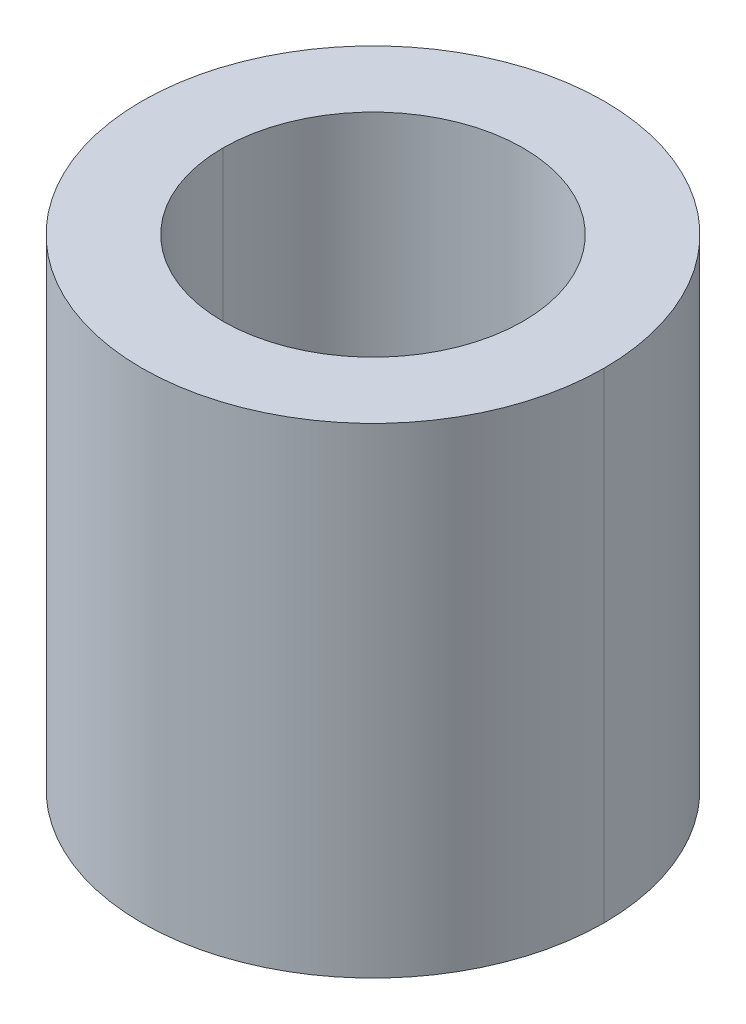
ISO-10303-21;
HEADER;
FILE_DESCRIPTION(('STEP AP214'),'2;1');
FILE_NAME('part.step','',(''),(''),'','','');
FILE_SCHEMA(('AUTOMOTIVE_DESIGN { 1 0 10303 214 1 1 1 1 }'));
ENDSEC;
DATA;
#1=APPLICATION_CONTEXT('core data for automotive mechanical design processes');
#2=APPLICATION_PROTOCOL_DEFINITION('international standard','automotive_design',2000,#1);
#3=PRODUCT_CONTEXT('',#1,'mechanical');
#4=PRODUCT('Part','Part','',(#3));
#5=PRODUCT_RELATED_PRODUCT_CATEGORY('part','',(#4));
#6=PRODUCT_DEFINITION_FORMATION('','',#4);
#7=PRODUCT_DEFINITION_CONTEXT('part definition',#1,'design');
#8=PRODUCT_DEFINITION('design','',#6,#7);
#9=PRODUCT_DEFINITION_SHAPE('','',#8);
#10=(LENGTH_UNIT() NAMED_UNIT(*) SI_UNIT(.MILLI.,.METRE.));
#11=(NAMED_UNIT(*) PLANE_ANGLE_UNIT() SI_UNIT($,.RADIAN.));
#12=(NAMED_UNIT(*) SI_UNIT($,.STERADIAN.) SOLID_ANGLE_UNIT());
#13=UNCERTAINTY_MEASURE_WITH_UNIT(LENGTH_MEASURE(1.E-05),#10,'distance_accuracy_value','');
#14=(GEOMETRIC_REPRESENTATION_CONTEXT(3) GLOBAL_UNCERTAINTY_ASSIGNED_CONTEXT((#13)) GLOBAL_UNIT_ASSIGNED_CONTEXT((#10,
#11,#12)) REPRESENTATION_CONTEXT('',''));
#15=CARTESIAN_POINT('',(0.,0.,0.));
#16=DIRECTION('',(0.,0.,1.));
#17=DIRECTION('',(1.,0.,0.));
#18=AXIS2_PLACEMENT_3D('',#15,#16,#17);
#19=CARTESIAN_POINT('',(0.,0.,0.));
#20=DIRECTION('',(0.,1.,0.));
#21=DIRECTION('',(1.,0.,0.));
#22=AXIS2_PLACEMENT_3D('',#19,#20,#21);
#23=PLANE('',#22);
#24=CARTESIAN_POINT('',(0.,0.,0.));
#25=DIRECTION('',(0.,1.,0.));
#26=DIRECTION('',(-1.,0.,0.));
#27=AXIS2_PLACEMENT_3D('',#24,#25,#26);
#28=CIRCLE('',#27,1.925);
#29=CARTESIAN_POINT('',(-1.925,0.,0.));
#30=VERTEX_POINT('',#29);
#31=CARTESIAN_POINT('',(1.925,0.,0.));
#32=VERTEX_POINT('',#31);
#33=EDGE_CURVE('E42',#30,#32,#28,.T.);
#34=ORIENTED_EDGE('',*,*,#33,.F.);
#35=CARTESIAN_POINT('',(0.,0.,0.));
#36=DIRECTION('',(0.,1.,0.));
#37=DIRECTION('',(1.,0.,0.));
#38=AXIS2_PLACEMENT_3D('',#35,#36,#37);
#39=CIRCLE('',#38,1.925);
#40=EDGE_CURVE('E111',#32,#30,#39,.T.);
#41=ORIENTED_EDGE('',*,*,#40,.F.);
#42=EDGE_LOOP('',(#34,#41));
#43=FACE_BOUND('',#42,.T.);
#44=CARTESIAN_POINT('',(0.,0.,0.));
#45=DIRECTION('',(0.,-1.,0.));
#46=DIRECTION('',(-1.,0.,0.));
#47=AXIS2_PLACEMENT_3D('',#44,#45,#46);
#48=CIRCLE('',#47,1.25);
#49=CARTESIAN_POINT('',(-1.25,0.,0.));
#50=VERTEX_POINT('',#49);
#51=CARTESIAN_POINT('',(1.25,0.,0.));
#52=VERTEX_POINT('',#51);
#53=EDGE_CURVE('E21',#50,#52,#48,.T.);
#54=ORIENTED_EDGE('',*,*,#53,.F.);
#55=CARTESIAN_POINT('',(0.,0.,0.));
#56=DIRECTION('',(0.,-1.,0.));
#57=DIRECTION('',(1.,0.,0.));
#58=AXIS2_PLACEMENT_3D('',#55,#56,#57);
#59=CIRCLE('',#58,1.25);
#60=EDGE_CURVE('E28',#52,#50,#59,.T.);
#61=ORIENTED_EDGE('',*,*,#60,.F.);
#62=EDGE_LOOP('',(#54,#61));
#63=FACE_BOUND('',#62,.T.);
#64=ADVANCED_FACE('F17',(#43,#63),#23,.F.);
#65=CARTESIAN_POINT('',(0.,0.,0.));
#66=DIRECTION('',(0.,1.,0.));
#67=DIRECTION('',(1.,0.,0.));
#68=AXIS2_PLACEMENT_3D('',#65,#66,#67);
#69=CYLINDRICAL_SURFACE('',#68,1.25);
#70=DIRECTION('',(0.,1.,0.));
#71=VECTOR('',#70,1.);
#72=CARTESIAN_POINT('',(-1.25,0.,0.));
#73=LINE('',#72,#71);
#74=CARTESIAN_POINT('',(-1.25,4.,0.));
#75=VERTEX_POINT('',#74);
#76=EDGE_CURVE('E11',#50,#75,#73,.T.);
#77=ORIENTED_EDGE('',*,*,#76,.T.);
#78=CARTESIAN_POINT('',(0.,4.,0.));
#79=DIRECTION('',(0.,-1.,0.));
#80=DIRECTION('',(1.,0.,0.));
#81=AXIS2_PLACEMENT_3D('',#78,#79,#80);
#82=CIRCLE('',#81,1.25);
#83=CARTESIAN_POINT('',(1.25,4.,0.));
#84=VERTEX_POINT('',#83);
#85=EDGE_CURVE('E81',#84,#75,#82,.T.);
#86=ORIENTED_EDGE('',*,*,#85,.F.);
#87=DIRECTION('',(0.,1.,0.));
#88=VECTOR('',#87,1.);
#89=CARTESIAN_POINT('',(1.25,0.,0.));
#90=LINE('',#89,#88);
#91=EDGE_CURVE('E85',#52,#84,#90,.T.);
#92=ORIENTED_EDGE('',*,*,#91,.F.);
#93=ORIENTED_EDGE('',*,*,#60,.T.);
#94=EDGE_LOOP('',(#77,#86,#92,#93));
#95=FACE_BOUND('',#94,.T.);
#96=ADVANCED_FACE('F83',(#95),#69,.F.);
#97=CARTESIAN_POINT('',(0.,0.,0.));
#98=DIRECTION('',(0.,1.,0.));
#99=DIRECTION('',(1.,0.,0.));
#100=AXIS2_PLACEMENT_3D('',#97,#98,#99);
#101=CYLINDRICAL_SURFACE('',#100,1.25);
#102=ORIENTED_EDGE('',*,*,#91,.T.);
#103=CARTESIAN_POINT('',(0.,4.,0.));
#104=DIRECTION('',(0.,-1.,0.));
#105=DIRECTION('',(-1.,0.,0.));
#106=AXIS2_PLACEMENT_3D('',#103,#104,#105);
#107=CIRCLE('',#106,1.25);
#108=EDGE_CURVE('E91',#75,#84,#107,.T.);
#109=ORIENTED_EDGE('',*,*,#108,.F.);
#110=ORIENTED_EDGE('',*,*,#76,.F.);
#111=ORIENTED_EDGE('',*,*,#53,.T.);
#112=EDGE_LOOP('',(#102,#109,#110,#111));
#113=FACE_BOUND('',#112,.T.);
#114=ADVANCED_FACE('F95',(#113),#101,.F.);
#115=CARTESIAN_POINT('',(0.,4.,0.));
#116=DIRECTION('',(0.,1.,0.));
#117=DIRECTION('',(1.,0.,0.));
#118=AXIS2_PLACEMENT_3D('',#115,#116,#117);
#119=PLANE('',#118);
#120=CARTESIAN_POINT('',(0.,4.,0.));
#121=DIRECTION('',(0.,1.,0.));
#122=DIRECTION('',(-1.,0.,0.));
#123=AXIS2_PLACEMENT_3D('',#120,#121,#122);
#124=CIRCLE('',#123,1.925);
#125=CARTESIAN_POINT('',(-1.925,4.,0.));
#126=VERTEX_POINT('',#125);
#127=CARTESIAN_POINT('',(1.925,4.,0.));
#128=VERTEX_POINT('',#127);
#129=EDGE_CURVE('E103',#126,#128,#124,.T.);
#130=ORIENTED_EDGE('',*,*,#129,.T.);
#131=CARTESIAN_POINT('',(0.,4.,0.));
#132=DIRECTION('',(0.,1.,0.));
#133=DIRECTION('',(1.,0.,0.));
#134=AXIS2_PLACEMENT_3D('',#131,#132,#133);
#135=CIRCLE('',#134,1.925);
#136=EDGE_CURVE('E68',#128,#126,#135,.T.);
#137=ORIENTED_EDGE('',*,*,#136,.T.);
#138=EDGE_LOOP('',(#130,#137));
#139=FACE_BOUND('',#138,.T.);
#140=ORIENTED_EDGE('',*,*,#108,.T.);
#141=ORIENTED_EDGE('',*,*,#85,.T.);
#142=EDGE_LOOP('',(#140,#141));
#143=FACE_BOUND('',#142,.T.);
#144=ADVANCED_FACE('F19',(#139,#143),#119,.T.);
#145=CARTESIAN_POINT('',(0.,0.,0.));
#146=DIRECTION('',(0.,1.,0.));
#147=DIRECTION('',(1.,0.,0.));
#148=AXIS2_PLACEMENT_3D('',#145,#146,#147);
#149=CYLINDRICAL_SURFACE('',#148,1.925);
#150=DIRECTION('',(0.,1.,0.));
#151=VECTOR('',#150,1.);
#152=CARTESIAN_POINT('',(-1.925,0.,0.));
#153=LINE('',#152,#151);
#154=EDGE_CURVE('E92',#30,#126,#153,.T.);
#155=ORIENTED_EDGE('',*,*,#154,.T.);
#156=ORIENTED_EDGE('',*,*,#136,.F.);
#157=DIRECTION('',(0.,1.,0.));
#158=VECTOR('',#157,1.);
#159=CARTESIAN_POINT('',(1.925,0.,0.));
#160=LINE('',#159,#158);
#161=EDGE_CURVE('E112',#32,#128,#160,.T.);
#162=ORIENTED_EDGE('',*,*,#161,.F.);
#163=ORIENTED_EDGE('',*,*,#40,.T.);
#164=EDGE_LOOP('',(#155,#156,#162,#163));
#165=FACE_BOUND('',#164,.T.);
#166=ADVANCED_FACE('F156',(#165),#149,.T.);
#167=CARTESIAN_POINT('',(0.,0.,0.));
#168=DIRECTION('',(0.,1.,0.));
#169=DIRECTION('',(1.,0.,0.));
#170=AXIS2_PLACEMENT_3D('',#167,#168,#169);
#171=CYLINDRICAL_SURFACE('',#170,1.925);
#172=ORIENTED_EDGE('',*,*,#161,.T.);
#173=ORIENTED_EDGE('',*,*,#129,.F.);
#174=ORIENTED_EDGE('',*,*,#154,.F.);
#175=ORIENTED_EDGE('',*,*,#33,.T.);
#176=EDGE_LOOP('',(#172,#173,#174,#175));
#177=FACE_BOUND('',#176,.T.);
#178=ADVANCED_FACE('F151',(#177),#171,.T.);
#179=CLOSED_SHELL('',(#64,#96,#114,#144,#166,#178));
#180=MANIFOLD_SOLID_BREP('B1',#179);
#181=ADVANCED_BREP_SHAPE_REPRESENTATION('',(#18,#180),#14);
#182=SHAPE_DEFINITION_REPRESENTATION(#9,#181);
ENDSEC;
END-ISO-10303-21;
